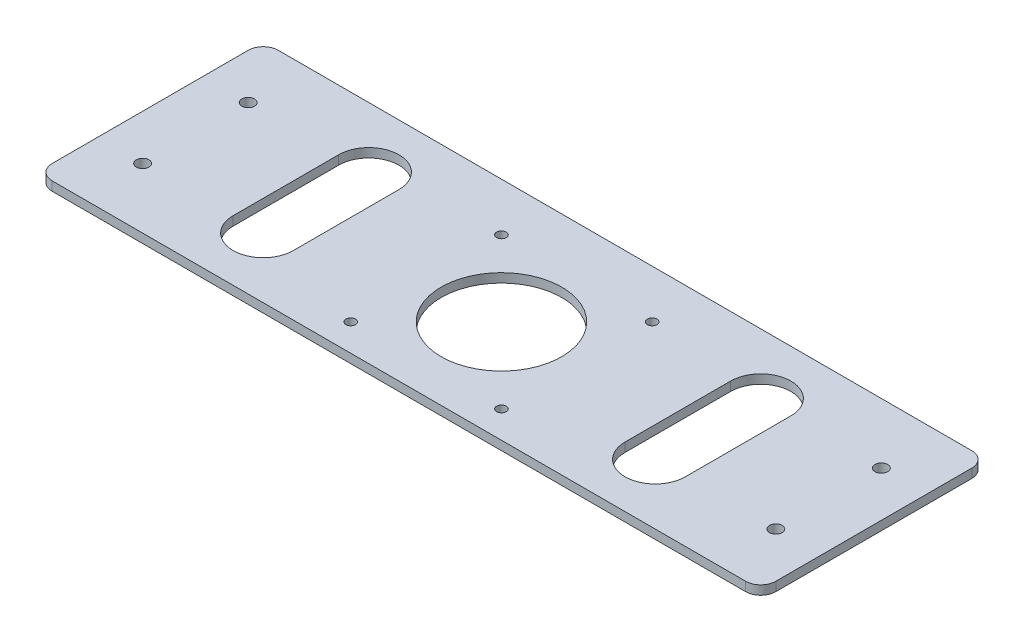
ISO-10303-21;
HEADER;
FILE_DESCRIPTION(('STEP AP214'),'2;1');
FILE_NAME('part.step','',(''),(''),'','','');
FILE_SCHEMA(('AUTOMOTIVE_DESIGN { 1 0 10303 214 1 1 1 1 }'));
ENDSEC;
DATA;
#1=APPLICATION_CONTEXT('core data for automotive mechanical design processes');
#2=APPLICATION_PROTOCOL_DEFINITION('international standard','automotive_design',2000,#1);
#3=PRODUCT_CONTEXT('',#1,'mechanical');
#4=PRODUCT('Part','Part','',(#3));
#5=PRODUCT_RELATED_PRODUCT_CATEGORY('part','',(#4));
#6=PRODUCT_DEFINITION_FORMATION('','',#4);
#7=PRODUCT_DEFINITION_CONTEXT('part definition',#1,'design');
#8=PRODUCT_DEFINITION('design','',#6,#7);
#9=PRODUCT_DEFINITION_SHAPE('','',#8);
#10=(LENGTH_UNIT() NAMED_UNIT(*) SI_UNIT(.MILLI.,.METRE.));
#11=(NAMED_UNIT(*) PLANE_ANGLE_UNIT() SI_UNIT($,.RADIAN.));
#12=(NAMED_UNIT(*) SI_UNIT($,.STERADIAN.) SOLID_ANGLE_UNIT());
#13=UNCERTAINTY_MEASURE_WITH_UNIT(LENGTH_MEASURE(1.E-05),#10,'distance_accuracy_value','');
#14=(GEOMETRIC_REPRESENTATION_CONTEXT(3) GLOBAL_UNCERTAINTY_ASSIGNED_CONTEXT((#13)) GLOBAL_UNIT_ASSIGNED_CONTEXT((#10,
#11,#12)) REPRESENTATION_CONTEXT('',''));
#15=CARTESIAN_POINT('',(0.,0.,0.));
#16=DIRECTION('',(0.,0.,1.));
#17=DIRECTION('',(1.,0.,0.));
#18=AXIS2_PLACEMENT_3D('',#15,#16,#17);
#19=CARTESIAN_POINT('',(0.,3.,0.));
#20=DIRECTION('',(0.,1.,0.));
#21=DIRECTION('',(0.,0.,1.));
#22=AXIS2_PLACEMENT_3D('',#19,#20,#21);
#23=PLANE('',#22);
#24=CARTESIAN_POINT('',(57.8259247718773,3.,29.8717507315553));
#25=DIRECTION('',(0.,1.,0.));
#26=DIRECTION('',(0.,0.,1.));
#27=AXIS2_PLACEMENT_3D('',#24,#25,#26);
#28=CIRCLE('',#27,1.60000000000002);
#29=CARTESIAN_POINT('',(57.8259247718773,3.,31.4717507315553));
#30=VERTEX_POINT('',#29);
#31=EDGE_CURVE('E271',#30,#30,#28,.F.);
#32=ORIENTED_EDGE('',*,*,#31,.T.);
#33=EDGE_LOOP('',(#32));
#34=FACE_BOUND('',#33,.T.);
#35=CARTESIAN_POINT('',(57.8259247718773,3.,79.8717507315553));
#36=DIRECTION('',(0.,1.,0.));
#37=DIRECTION('',(0.,0.,1.));
#38=AXIS2_PLACEMENT_3D('',#35,#36,#37);
#39=CIRCLE('',#38,1.60000000000002);
#40=CARTESIAN_POINT('',(57.8259247718773,3.,81.4717507315553));
#41=VERTEX_POINT('',#40);
#42=EDGE_CURVE('E268',#41,#41,#39,.T.);
#43=ORIENTED_EDGE('',*,*,#42,.F.);
#44=EDGE_LOOP('',(#43));
#45=FACE_BOUND('',#44,.T.);
#46=CARTESIAN_POINT('',(7.82592477187729,3.,29.8717507315553));
#47=DIRECTION('',(0.,1.,0.));
#48=DIRECTION('',(0.,0.,1.));
#49=AXIS2_PLACEMENT_3D('',#46,#47,#48);
#50=CIRCLE('',#49,1.6);
#51=CARTESIAN_POINT('',(7.82592477187729,3.,31.4717507315553));
#52=VERTEX_POINT('',#51);
#53=EDGE_CURVE('E265',#52,#52,#50,.T.);
#54=ORIENTED_EDGE('',*,*,#53,.F.);
#55=EDGE_LOOP('',(#54));
#56=FACE_BOUND('',#55,.T.);
#57=CARTESIAN_POINT('',(7.82592477187729,3.,79.8717507315553));
#58=DIRECTION('',(0.,1.,0.));
#59=DIRECTION('',(0.,0.,1.));
#60=AXIS2_PLACEMENT_3D('',#57,#58,#59);
#61=CIRCLE('',#60,1.6);
#62=CARTESIAN_POINT('',(7.82592477187729,3.,81.4717507315553));
#63=VERTEX_POINT('',#62);
#64=EDGE_CURVE('E262',#63,#63,#61,.F.);
#65=ORIENTED_EDGE('',*,*,#64,.T.);
#66=EDGE_LOOP('',(#65));
#67=FACE_BOUND('',#66,.T.);
#68=CARTESIAN_POINT('',(32.8259247718773,3.,54.8717507315553));
#69=DIRECTION('',(0.,1.,0.));
#70=DIRECTION('',(0.,0.,1.));
#71=AXIS2_PLACEMENT_3D('',#68,#69,#70);
#72=CIRCLE('',#71,20.);
#73=CARTESIAN_POINT('',(32.8259247718773,3.,74.8717507315553));
#74=VERTEX_POINT('',#73);
#75=EDGE_CURVE('E259',#74,#74,#72,.T.);
#76=ORIENTED_EDGE('',*,*,#75,.F.);
#77=EDGE_LOOP('',(#76));
#78=FACE_BOUND('',#77,.T.);
#79=CARTESIAN_POINT('',(-72.1740752281227,3.,33.8717507315553));
#80=DIRECTION('',(0.,1.,0.));
#81=DIRECTION('',(0.,0.,1.));
#82=AXIS2_PLACEMENT_3D('',#79,#80,#81);
#83=CIRCLE('',#82,2.1);
#84=CARTESIAN_POINT('',(-72.1740752281227,3.,35.9717507315553));
#85=VERTEX_POINT('',#84);
#86=EDGE_CURVE('E244',#85,#85,#83,.T.);
#87=ORIENTED_EDGE('',*,*,#86,.F.);
#88=EDGE_LOOP('',(#87));
#89=FACE_BOUND('',#88,.T.);
#90=CARTESIAN_POINT('',(-72.1740752281227,3.,68.8717507315553));
#91=DIRECTION('',(0.,1.,0.));
#92=DIRECTION('',(0.,0.,1.));
#93=AXIS2_PLACEMENT_3D('',#90,#91,#92);
#94=CIRCLE('',#93,2.1);
#95=CARTESIAN_POINT('',(-72.1740752281227,3.,70.9717507315553));
#96=VERTEX_POINT('',#95);
#97=EDGE_CURVE('E230',#96,#96,#94,.T.);
#98=ORIENTED_EDGE('',*,*,#97,.F.);
#99=EDGE_LOOP('',(#98));
#100=FACE_BOUND('',#99,.T.);
#101=CARTESIAN_POINT('',(137.825924771877,3.,68.8717507315553));
#102=DIRECTION('',(0.,1.,0.));
#103=DIRECTION('',(0.,0.,-1.));
#104=AXIS2_PLACEMENT_3D('',#101,#102,#103);
#105=CIRCLE('',#104,2.10000000000002);
#106=CARTESIAN_POINT('',(137.825924771877,3.,66.7717507315553));
#107=VERTEX_POINT('',#106);
#108=EDGE_CURVE('E237',#107,#107,#105,.T.);
#109=ORIENTED_EDGE('',*,*,#108,.F.);
#110=EDGE_LOOP('',(#109));
#111=FACE_BOUND('',#110,.T.);
#112=CARTESIAN_POINT('',(137.825924771877,3.,33.8717507315553));
#113=DIRECTION('',(0.,1.,0.));
#114=DIRECTION('',(0.,0.,-1.));
#115=AXIS2_PLACEMENT_3D('',#112,#113,#114);
#116=CIRCLE('',#115,2.10000000000002);
#117=CARTESIAN_POINT('',(137.825924771877,3.,31.7717507315553));
#118=VERTEX_POINT('',#117);
#119=EDGE_CURVE('E243',#118,#118,#116,.T.);
#120=ORIENTED_EDGE('',*,*,#119,.F.);
#121=EDGE_LOOP('',(#120));
#122=FACE_BOUND('',#121,.T.);
#123=DIRECTION('',(0.,0.,-1.));
#124=VECTOR('',#123,1.);
#125=CARTESIAN_POINT('',(-22.1740752281227,3.,68.8717507315553));
#126=LINE('',#125,#124);
#127=CARTESIAN_POINT('',(-22.1740752281227,3.,68.8717507315553));
#128=VERTEX_POINT('',#127);
#129=CARTESIAN_POINT('',(-22.1740752281227,3.,33.8717507315553));
#130=VERTEX_POINT('',#129);
#131=EDGE_CURVE('E165',#128,#130,#126,.T.);
#132=ORIENTED_EDGE('',*,*,#131,.F.);
#133=CARTESIAN_POINT('',(-32.1740752281227,3.,68.8717507315553));
#134=DIRECTION('',(0.,1.,0.));
#135=DIRECTION('',(0.,0.,1.));
#136=AXIS2_PLACEMENT_3D('',#133,#134,#135);
#137=CIRCLE('',#136,9.99999999999999);
#138=CARTESIAN_POINT('',(-42.1740752281227,3.,68.8717507315553));
#139=VERTEX_POINT('',#138);
#140=EDGE_CURVE('E155',#139,#128,#137,.T.);
#141=ORIENTED_EDGE('',*,*,#140,.F.);
#142=DIRECTION('',(0.,0.,1.));
#143=VECTOR('',#142,1.);
#144=CARTESIAN_POINT('',(-42.1740752281227,3.,68.8717507315553));
#145=LINE('',#144,#143);
#146=CARTESIAN_POINT('',(-42.1740752281227,3.,33.8717507315553));
#147=VERTEX_POINT('',#146);
#148=EDGE_CURVE('E181',#147,#139,#145,.T.);
#149=ORIENTED_EDGE('',*,*,#148,.F.);
#150=CARTESIAN_POINT('',(-32.1740752281227,3.,33.8717507315553));
#151=DIRECTION('',(0.,1.,0.));
#152=DIRECTION('',(0.,0.,1.));
#153=AXIS2_PLACEMENT_3D('',#150,#151,#152);
#154=CIRCLE('',#153,9.99999999999999);
#155=EDGE_CURVE('E179',#130,#147,#154,.T.);
#156=ORIENTED_EDGE('',*,*,#155,.F.);
#157=EDGE_LOOP('',(#132,#141,#149,#156));
#158=FACE_BOUND('',#157,.T.);
#159=DIRECTION('',(0.,0.,-1.));
#160=VECTOR('',#159,1.);
#161=CARTESIAN_POINT('',(107.825924771877,3.,68.8717507315553));
#162=LINE('',#161,#160);
#163=CARTESIAN_POINT('',(107.825924771877,3.,68.8717507315553));
#164=VERTEX_POINT('',#163);
#165=CARTESIAN_POINT('',(107.825924771877,3.,33.8717507315553));
#166=VERTEX_POINT('',#165);
#167=EDGE_CURVE('E201',#164,#166,#162,.T.);
#168=ORIENTED_EDGE('',*,*,#167,.F.);
#169=CARTESIAN_POINT('',(97.8259247718773,3.,68.8717507315553));
#170=DIRECTION('',(0.,1.,0.));
#171=DIRECTION('',(0.,0.,-1.));
#172=AXIS2_PLACEMENT_3D('',#169,#170,#171);
#173=CIRCLE('',#172,9.99999999999999);
#174=CARTESIAN_POINT('',(87.8259247718773,3.,68.8717507315553));
#175=VERTEX_POINT('',#174);
#176=EDGE_CURVE('E199',#175,#164,#173,.T.);
#177=ORIENTED_EDGE('',*,*,#176,.F.);
#178=DIRECTION('',(0.,0.,1.));
#179=VECTOR('',#178,1.);
#180=CARTESIAN_POINT('',(87.8259247718773,3.,68.8717507315553));
#181=LINE('',#180,#179);
#182=CARTESIAN_POINT('',(87.8259247718773,3.,33.8717507315553));
#183=VERTEX_POINT('',#182);
#184=EDGE_CURVE('E207',#183,#175,#181,.T.);
#185=ORIENTED_EDGE('',*,*,#184,.F.);
#186=CARTESIAN_POINT('',(97.8259247718773,3.,33.8717507315553));
#187=DIRECTION('',(0.,1.,0.));
#188=DIRECTION('',(0.,0.,-1.));
#189=AXIS2_PLACEMENT_3D('',#186,#187,#188);
#190=CIRCLE('',#189,9.99999999999999);
#191=EDGE_CURVE('E204',#166,#183,#190,.T.);
#192=ORIENTED_EDGE('',*,*,#191,.F.);
#193=EDGE_LOOP('',(#168,#177,#185,#192));
#194=FACE_BOUND('',#193,.T.);
#195=DIRECTION('',(1.,0.,0.));
#196=VECTOR('',#195,1.);
#197=CARTESIAN_POINT('',(0.,3.,13.8717507315553));
#198=LINE('',#197,#196);
#199=CARTESIAN_POINT('',(-82.1740752281227,3.,13.8717507315553));
#200=VERTEX_POINT('',#199);
#201=CARTESIAN_POINT('',(147.825924771877,3.,13.8717507315553));
#202=VERTEX_POINT('',#201);
#203=EDGE_CURVE('E214',#200,#202,#198,.T.);
#204=ORIENTED_EDGE('',*,*,#203,.F.);
#205=CARTESIAN_POINT('',(-82.1740752281227,3.,18.8717507315553));
#206=DIRECTION('',(0.,1.,0.));
#207=DIRECTION('',(0.,0.,1.));
#208=AXIS2_PLACEMENT_3D('',#205,#206,#207);
#209=CIRCLE('',#208,5.);
#210=CARTESIAN_POINT('',(-87.1740752281227,3.,18.8717507315553));
#211=VERTEX_POINT('',#210);
#212=EDGE_CURVE('E321',#200,#211,#209,.T.);
#213=ORIENTED_EDGE('',*,*,#212,.T.);
#214=DIRECTION('',(0.,0.,-1.));
#215=VECTOR('',#214,1.);
#216=CARTESIAN_POINT('',(-87.1740752281227,3.,0.));
#217=LINE('',#216,#215);
#218=CARTESIAN_POINT('',(-87.1740752281227,3.,83.8717507315553));
#219=VERTEX_POINT('',#218);
#220=EDGE_CURVE('E250',#219,#211,#217,.T.);
#221=ORIENTED_EDGE('',*,*,#220,.F.);
#222=CARTESIAN_POINT('',(-82.1740752281227,3.,83.8717507315553));
#223=DIRECTION('',(0.,1.,0.));
#224=DIRECTION('',(0.,0.,1.));
#225=AXIS2_PLACEMENT_3D('',#222,#223,#224);
#226=CIRCLE('',#225,5.);
#227=CARTESIAN_POINT('',(-82.1740752281227,3.,88.8717507315553));
#228=VERTEX_POINT('',#227);
#229=EDGE_CURVE('E298',#219,#228,#226,.T.);
#230=ORIENTED_EDGE('',*,*,#229,.T.);
#231=DIRECTION('',(1.,0.,0.));
#232=VECTOR('',#231,1.);
#233=CARTESIAN_POINT('',(0.,3.,88.8717507315553));
#234=LINE('',#233,#232);
#235=CARTESIAN_POINT('',(147.825924771877,3.,88.8717507315553));
#236=VERTEX_POINT('',#235);
#237=EDGE_CURVE('E252',#228,#236,#234,.T.);
#238=ORIENTED_EDGE('',*,*,#237,.T.);
#239=CARTESIAN_POINT('',(147.825924771877,3.,83.8717507315553));
#240=DIRECTION('',(0.,1.,0.));
#241=DIRECTION('',(0.,0.,1.));
#242=AXIS2_PLACEMENT_3D('',#239,#240,#241);
#243=CIRCLE('',#242,5.);
#244=CARTESIAN_POINT('',(152.825924771877,3.,83.8717507315553));
#245=VERTEX_POINT('',#244);
#246=EDGE_CURVE('E300',#236,#245,#243,.T.);
#247=ORIENTED_EDGE('',*,*,#246,.T.);
#248=DIRECTION('',(0.,0.,-1.));
#249=VECTOR('',#248,1.);
#250=CARTESIAN_POINT('',(152.825924771877,3.,0.));
#251=LINE('',#250,#249);
#252=CARTESIAN_POINT('',(152.825924771877,3.,18.8717507315553));
#253=VERTEX_POINT('',#252);
#254=EDGE_CURVE('E256',#245,#253,#251,.T.);
#255=ORIENTED_EDGE('',*,*,#254,.T.);
#256=CARTESIAN_POINT('',(147.825924771877,3.,18.8717507315553));
#257=DIRECTION('',(0.,1.,0.));
#258=DIRECTION('',(0.,0.,1.));
#259=AXIS2_PLACEMENT_3D('',#256,#257,#258);
#260=CIRCLE('',#259,5.);
#261=EDGE_CURVE('E319',#253,#202,#260,.T.);
#262=ORIENTED_EDGE('',*,*,#261,.T.);
#263=EDGE_LOOP('',(#204,#213,#221,#230,#238,#247,#255,#262));
#264=FACE_BOUND('',#263,.T.);
#265=ADVANCED_FACE('F37',(#34,#45,#56,#67,#78,#89,#100,#111,#122,#158,#194,#264),#23,.T.);
#266=CARTESIAN_POINT('',(0.,0.,0.));
#267=DIRECTION('',(0.,1.,0.));
#268=DIRECTION('',(0.,0.,1.));
#269=AXIS2_PLACEMENT_3D('',#266,#267,#268);
#270=PLANE('',#269);
#271=CARTESIAN_POINT('',(57.8259247718773,0.,29.8717507315553));
#272=DIRECTION('',(0.,1.,0.));
#273=DIRECTION('',(0.,0.,1.));
#274=AXIS2_PLACEMENT_3D('',#271,#272,#273);
#275=CIRCLE('',#274,1.60000000000002);
#276=CARTESIAN_POINT('',(57.8259247718773,0.,31.4717507315553));
#277=VERTEX_POINT('',#276);
#278=EDGE_CURVE('E253',#277,#277,#275,.F.);
#279=ORIENTED_EDGE('',*,*,#278,.F.);
#280=EDGE_LOOP('',(#279));
#281=FACE_BOUND('',#280,.T.);
#282=CARTESIAN_POINT('',(57.8259247718773,0.,79.8717507315553));
#283=DIRECTION('',(0.,1.,0.));
#284=DIRECTION('',(0.,0.,1.));
#285=AXIS2_PLACEMENT_3D('',#282,#283,#284);
#286=CIRCLE('',#285,1.60000000000002);
#287=CARTESIAN_POINT('',(57.8259247718773,0.,81.4717507315553));
#288=VERTEX_POINT('',#287);
#289=EDGE_CURVE('E290',#288,#288,#286,.T.);
#290=ORIENTED_EDGE('',*,*,#289,.T.);
#291=EDGE_LOOP('',(#290));
#292=FACE_BOUND('',#291,.T.);
#293=CARTESIAN_POINT('',(7.82592477187729,0.,29.8717507315553));
#294=DIRECTION('',(0.,1.,0.));
#295=DIRECTION('',(0.,0.,1.));
#296=AXIS2_PLACEMENT_3D('',#293,#294,#295);
#297=CIRCLE('',#296,1.6);
#298=CARTESIAN_POINT('',(7.82592477187729,0.,31.4717507315553));
#299=VERTEX_POINT('',#298);
#300=EDGE_CURVE('E287',#299,#299,#297,.T.);
#301=ORIENTED_EDGE('',*,*,#300,.T.);
#302=EDGE_LOOP('',(#301));
#303=FACE_BOUND('',#302,.T.);
#304=CARTESIAN_POINT('',(7.82592477187729,0.,79.8717507315553));
#305=DIRECTION('',(0.,1.,0.));
#306=DIRECTION('',(0.,0.,1.));
#307=AXIS2_PLACEMENT_3D('',#304,#305,#306);
#308=CIRCLE('',#307,1.6);
#309=CARTESIAN_POINT('',(7.82592477187729,0.,81.4717507315553));
#310=VERTEX_POINT('',#309);
#311=EDGE_CURVE('E284',#310,#310,#308,.F.);
#312=ORIENTED_EDGE('',*,*,#311,.F.);
#313=EDGE_LOOP('',(#312));
#314=FACE_BOUND('',#313,.T.);
#315=CARTESIAN_POINT('',(32.8259247718773,0.,54.8717507315553));
#316=DIRECTION('',(0.,1.,0.));
#317=DIRECTION('',(0.,0.,1.));
#318=AXIS2_PLACEMENT_3D('',#315,#316,#317);
#319=CIRCLE('',#318,20.);
#320=CARTESIAN_POINT('',(32.8259247718773,0.,74.8717507315553));
#321=VERTEX_POINT('',#320);
#322=EDGE_CURVE('E281',#321,#321,#319,.T.);
#323=ORIENTED_EDGE('',*,*,#322,.T.);
#324=EDGE_LOOP('',(#323));
#325=FACE_BOUND('',#324,.T.);
#326=CARTESIAN_POINT('',(-72.1740752281227,0.,33.8717507315553));
#327=DIRECTION('',(0.,1.,0.));
#328=DIRECTION('',(0.,0.,1.));
#329=AXIS2_PLACEMENT_3D('',#326,#327,#328);
#330=CIRCLE('',#329,2.1);
#331=CARTESIAN_POINT('',(-72.1740752281227,0.,35.9717507315553));
#332=VERTEX_POINT('',#331);
#333=EDGE_CURVE('E233',#332,#332,#330,.T.);
#334=ORIENTED_EDGE('',*,*,#333,.T.);
#335=EDGE_LOOP('',(#334));
#336=FACE_BOUND('',#335,.T.);
#337=CARTESIAN_POINT('',(-72.1740752281227,0.,68.8717507315553));
#338=DIRECTION('',(0.,1.,0.));
#339=DIRECTION('',(0.,0.,1.));
#340=AXIS2_PLACEMENT_3D('',#337,#338,#339);
#341=CIRCLE('',#340,2.1);
#342=CARTESIAN_POINT('',(-72.1740752281227,0.,70.9717507315553));
#343=VERTEX_POINT('',#342);
#344=EDGE_CURVE('E234',#343,#343,#341,.T.);
#345=ORIENTED_EDGE('',*,*,#344,.T.);
#346=EDGE_LOOP('',(#345));
#347=FACE_BOUND('',#346,.T.);
#348=CARTESIAN_POINT('',(137.825924771877,0.,68.8717507315553));
#349=DIRECTION('',(0.,1.,0.));
#350=DIRECTION('',(0.,0.,-1.));
#351=AXIS2_PLACEMENT_3D('',#348,#349,#350);
#352=CIRCLE('',#351,2.10000000000002);
#353=CARTESIAN_POINT('',(137.825924771877,0.,66.7717507315553));
#354=VERTEX_POINT('',#353);
#355=EDGE_CURVE('E240',#354,#354,#352,.T.);
#356=ORIENTED_EDGE('',*,*,#355,.T.);
#357=EDGE_LOOP('',(#356));
#358=FACE_BOUND('',#357,.T.);
#359=CARTESIAN_POINT('',(137.825924771877,0.,33.8717507315553));
#360=DIRECTION('',(0.,1.,0.));
#361=DIRECTION('',(0.,0.,-1.));
#362=AXIS2_PLACEMENT_3D('',#359,#360,#361);
#363=CIRCLE('',#362,2.10000000000002);
#364=CARTESIAN_POINT('',(137.825924771877,0.,31.7717507315553));
#365=VERTEX_POINT('',#364);
#366=EDGE_CURVE('E173',#365,#365,#363,.T.);
#367=ORIENTED_EDGE('',*,*,#366,.T.);
#368=EDGE_LOOP('',(#367));
#369=FACE_BOUND('',#368,.T.);
#370=CARTESIAN_POINT('',(-32.1740752281227,0.,68.8717507315553));
#371=DIRECTION('',(0.,1.,0.));
#372=DIRECTION('',(0.,0.,1.));
#373=AXIS2_PLACEMENT_3D('',#370,#371,#372);
#374=CIRCLE('',#373,9.99999999999999);
#375=CARTESIAN_POINT('',(-42.1740752281227,0.,68.8717507315553));
#376=VERTEX_POINT('',#375);
#377=CARTESIAN_POINT('',(-22.1740752281227,0.,68.8717507315553));
#378=VERTEX_POINT('',#377);
#379=EDGE_CURVE('E186',#376,#378,#374,.T.);
#380=ORIENTED_EDGE('',*,*,#379,.T.);
#381=DIRECTION('',(0.,0.,-1.));
#382=VECTOR('',#381,1.);
#383=CARTESIAN_POINT('',(-22.1740752281227,0.,68.8717507315553));
#384=LINE('',#383,#382);
#385=CARTESIAN_POINT('',(-22.1740752281227,0.,33.8717507315553));
#386=VERTEX_POINT('',#385);
#387=EDGE_CURVE('E172',#378,#386,#384,.T.);
#388=ORIENTED_EDGE('',*,*,#387,.T.);
#389=CARTESIAN_POINT('',(-32.1740752281227,0.,33.8717507315553));
#390=DIRECTION('',(0.,1.,0.));
#391=DIRECTION('',(0.,0.,1.));
#392=AXIS2_PLACEMENT_3D('',#389,#390,#391);
#393=CIRCLE('',#392,9.99999999999999);
#394=CARTESIAN_POINT('',(-42.1740752281227,0.,33.8717507315553));
#395=VERTEX_POINT('',#394);
#396=EDGE_CURVE('E190',#386,#395,#393,.T.);
#397=ORIENTED_EDGE('',*,*,#396,.T.);
#398=DIRECTION('',(0.,0.,1.));
#399=VECTOR('',#398,1.);
#400=CARTESIAN_POINT('',(-42.1740752281227,0.,68.8717507315553));
#401=LINE('',#400,#399);
#402=EDGE_CURVE('E166',#395,#376,#401,.T.);
#403=ORIENTED_EDGE('',*,*,#402,.T.);
#404=EDGE_LOOP('',(#380,#388,#397,#403));
#405=FACE_BOUND('',#404,.T.);
#406=CARTESIAN_POINT('',(97.8259247718773,0.,68.8717507315553));
#407=DIRECTION('',(0.,1.,0.));
#408=DIRECTION('',(0.,0.,-1.));
#409=AXIS2_PLACEMENT_3D('',#406,#407,#408);
#410=CIRCLE('',#409,9.99999999999999);
#411=CARTESIAN_POINT('',(87.8259247718773,0.,68.8717507315553));
#412=VERTEX_POINT('',#411);
#413=CARTESIAN_POINT('',(107.825924771877,0.,68.8717507315553));
#414=VERTEX_POINT('',#413);
#415=EDGE_CURVE('E210',#412,#414,#410,.T.);
#416=ORIENTED_EDGE('',*,*,#415,.T.);
#417=DIRECTION('',(0.,0.,-1.));
#418=VECTOR('',#417,1.);
#419=CARTESIAN_POINT('',(107.825924771877,0.,68.8717507315553));
#420=LINE('',#419,#418);
#421=CARTESIAN_POINT('',(107.825924771877,0.,33.8717507315553));
#422=VERTEX_POINT('',#421);
#423=EDGE_CURVE('E213',#414,#422,#420,.T.);
#424=ORIENTED_EDGE('',*,*,#423,.T.);
#425=CARTESIAN_POINT('',(97.8259247718773,0.,33.8717507315553));
#426=DIRECTION('',(0.,1.,0.));
#427=DIRECTION('',(0.,0.,-1.));
#428=AXIS2_PLACEMENT_3D('',#425,#426,#427);
#429=CIRCLE('',#428,9.99999999999999);
#430=CARTESIAN_POINT('',(87.8259247718773,0.,33.8717507315553));
#431=VERTEX_POINT('',#430);
#432=EDGE_CURVE('E217',#422,#431,#429,.T.);
#433=ORIENTED_EDGE('',*,*,#432,.T.);
#434=DIRECTION('',(0.,0.,1.));
#435=VECTOR('',#434,1.);
#436=CARTESIAN_POINT('',(87.8259247718773,0.,68.8717507315553));
#437=LINE('',#436,#435);
#438=EDGE_CURVE('E202',#431,#412,#437,.T.);
#439=ORIENTED_EDGE('',*,*,#438,.T.);
#440=EDGE_LOOP('',(#416,#424,#433,#439));
#441=FACE_BOUND('',#440,.T.);
#442=DIRECTION('',(0.,0.,-1.));
#443=VECTOR('',#442,1.);
#444=CARTESIAN_POINT('',(-87.1740752281227,0.,0.));
#445=LINE('',#444,#443);
#446=CARTESIAN_POINT('',(-87.1740752281227,0.,83.8717507315553));
#447=VERTEX_POINT('',#446);
#448=CARTESIAN_POINT('',(-87.1740752281227,0.,18.8717507315553));
#449=VERTEX_POINT('',#448);
#450=EDGE_CURVE('E247',#447,#449,#445,.T.);
#451=ORIENTED_EDGE('',*,*,#450,.T.);
#452=CARTESIAN_POINT('',(-82.1740752281227,0.,18.8717507315553));
#453=DIRECTION('',(0.,1.,0.));
#454=DIRECTION('',(0.,0.,1.));
#455=AXIS2_PLACEMENT_3D('',#452,#453,#454);
#456=CIRCLE('',#455,5.);
#457=CARTESIAN_POINT('',(-82.1740752281227,0.,13.8717507315553));
#458=VERTEX_POINT('',#457);
#459=EDGE_CURVE('E45',#449,#458,#456,.F.);
#460=ORIENTED_EDGE('',*,*,#459,.T.);
#461=DIRECTION('',(1.,0.,0.));
#462=VECTOR('',#461,1.);
#463=CARTESIAN_POINT('',(0.,0.,13.8717507315553));
#464=LINE('',#463,#462);
#465=CARTESIAN_POINT('',(147.825924771877,0.,13.8717507315553));
#466=VERTEX_POINT('',#465);
#467=EDGE_CURVE('E312',#458,#466,#464,.T.);
#468=ORIENTED_EDGE('',*,*,#467,.T.);
#469=CARTESIAN_POINT('',(147.825924771877,0.,18.8717507315553));
#470=DIRECTION('',(0.,1.,0.));
#471=DIRECTION('',(0.,0.,1.));
#472=AXIS2_PLACEMENT_3D('',#469,#470,#471);
#473=CIRCLE('',#472,5.);
#474=CARTESIAN_POINT('',(152.825924771877,0.,18.8717507315553));
#475=VERTEX_POINT('',#474);
#476=EDGE_CURVE('E52',#466,#475,#473,.F.);
#477=ORIENTED_EDGE('',*,*,#476,.T.);
#478=DIRECTION('',(0.,0.,-1.));
#479=VECTOR('',#478,1.);
#480=CARTESIAN_POINT('',(152.825924771877,0.,0.));
#481=LINE('',#480,#479);
#482=CARTESIAN_POINT('',(152.825924771877,0.,83.8717507315553));
#483=VERTEX_POINT('',#482);
#484=EDGE_CURVE('E279',#483,#475,#481,.T.);
#485=ORIENTED_EDGE('',*,*,#484,.F.);
#486=CARTESIAN_POINT('',(147.825924771877,0.,83.8717507315553));
#487=DIRECTION('',(0.,1.,0.));
#488=DIRECTION('',(0.,0.,1.));
#489=AXIS2_PLACEMENT_3D('',#486,#487,#488);
#490=CIRCLE('',#489,5.);
#491=CARTESIAN_POINT('',(147.825924771877,0.,88.8717507315553));
#492=VERTEX_POINT('',#491);
#493=EDGE_CURVE('E296',#483,#492,#490,.F.);
#494=ORIENTED_EDGE('',*,*,#493,.T.);
#495=DIRECTION('',(1.,0.,0.));
#496=VECTOR('',#495,1.);
#497=CARTESIAN_POINT('',(0.,0.,88.8717507315553));
#498=LINE('',#497,#496);
#499=CARTESIAN_POINT('',(-82.1740752281227,0.,88.8717507315553));
#500=VERTEX_POINT('',#499);
#501=EDGE_CURVE('E276',#500,#492,#498,.T.);
#502=ORIENTED_EDGE('',*,*,#501,.F.);
#503=CARTESIAN_POINT('',(-82.1740752281227,0.,83.8717507315553));
#504=DIRECTION('',(0.,1.,0.));
#505=DIRECTION('',(0.,0.,1.));
#506=AXIS2_PLACEMENT_3D('',#503,#504,#505);
#507=CIRCLE('',#506,5.);
#508=EDGE_CURVE('E274',#500,#447,#507,.F.);
#509=ORIENTED_EDGE('',*,*,#508,.T.);
#510=EDGE_LOOP('',(#451,#460,#468,#477,#485,#494,#502,#509));
#511=FACE_BOUND('',#510,.T.);
#512=ADVANCED_FACE('F326',(#281,#292,#303,#314,#325,#336,#347,#358,#369,#405,#441,#511),#270,.F.);
#513=CARTESIAN_POINT('',(-87.1740752281227,3.,0.));
#514=DIRECTION('',(-1.,0.,0.));
#515=DIRECTION('',(0.,0.,1.));
#516=AXIS2_PLACEMENT_3D('',#513,#514,#515);
#517=PLANE('',#516);
#518=ORIENTED_EDGE('',*,*,#220,.T.);
#519=DIRECTION('',(0.,1.,0.));
#520=VECTOR('',#519,1.);
#521=CARTESIAN_POINT('',(-87.1740752281227,0.,18.8717507315553));
#522=LINE('',#521,#520);
#523=EDGE_CURVE('E60',#211,#449,#522,.F.);
#524=ORIENTED_EDGE('',*,*,#523,.T.);
#525=ORIENTED_EDGE('',*,*,#450,.F.);
#526=DIRECTION('',(0.,-1.,0.));
#527=VECTOR('',#526,1.);
#528=CARTESIAN_POINT('',(-87.1740752281227,3.,83.8717507315553));
#529=LINE('',#528,#527);
#530=EDGE_CURVE('E310',#447,#219,#529,.F.);
#531=ORIENTED_EDGE('',*,*,#530,.T.);
#532=EDGE_LOOP('',(#518,#524,#525,#531));
#533=FACE_BOUND('',#532,.T.);
#534=ADVANCED_FACE('F338',(#533),#517,.T.);
#535=CARTESIAN_POINT('',(0.,3.,88.8717507315553));
#536=DIRECTION('',(0.,0.,-1.));
#537=DIRECTION('',(-1.,0.,0.));
#538=AXIS2_PLACEMENT_3D('',#535,#536,#537);
#539=PLANE('',#538);
#540=ORIENTED_EDGE('',*,*,#501,.T.);
#541=DIRECTION('',(0.,-1.,0.));
#542=VECTOR('',#541,1.);
#543=CARTESIAN_POINT('',(147.825924771877,3.,88.8717507315553));
#544=LINE('',#543,#542);
#545=EDGE_CURVE('E308',#492,#236,#544,.F.);
#546=ORIENTED_EDGE('',*,*,#545,.T.);
#547=ORIENTED_EDGE('',*,*,#237,.F.);
#548=DIRECTION('',(0.,-1.,0.));
#549=VECTOR('',#548,1.);
#550=CARTESIAN_POINT('',(-82.1740752281227,0.,88.8717507315553));
#551=LINE('',#550,#549);
#552=EDGE_CURVE('E305',#228,#500,#551,.T.);
#553=ORIENTED_EDGE('',*,*,#552,.T.);
#554=EDGE_LOOP('',(#540,#546,#547,#553));
#555=FACE_BOUND('',#554,.T.);
#556=ADVANCED_FACE('F346',(#555),#539,.F.);
#557=CARTESIAN_POINT('',(152.825924771877,3.,0.));
#558=DIRECTION('',(-1.,0.,0.));
#559=DIRECTION('',(0.,0.,1.));
#560=AXIS2_PLACEMENT_3D('',#557,#558,#559);
#561=PLANE('',#560);
#562=ORIENTED_EDGE('',*,*,#484,.T.);
#563=DIRECTION('',(0.,1.,0.));
#564=VECTOR('',#563,1.);
#565=CARTESIAN_POINT('',(152.825924771877,3.,18.8717507315553));
#566=LINE('',#565,#564);
#567=EDGE_CURVE('E11',#475,#253,#566,.T.);
#568=ORIENTED_EDGE('',*,*,#567,.T.);
#569=ORIENTED_EDGE('',*,*,#254,.F.);
#570=DIRECTION('',(0.,-1.,0.));
#571=VECTOR('',#570,1.);
#572=CARTESIAN_POINT('',(152.825924771877,3.,83.8717507315553));
#573=LINE('',#572,#571);
#574=EDGE_CURVE('E302',#245,#483,#573,.T.);
#575=ORIENTED_EDGE('',*,*,#574,.T.);
#576=EDGE_LOOP('',(#562,#568,#569,#575));
#577=FACE_BOUND('',#576,.T.);
#578=ADVANCED_FACE('F354',(#577),#561,.F.);
#579=CARTESIAN_POINT('',(57.8259247718773,3.,79.8717507315553));
#580=DIRECTION('',(0.,-1.,0.));
#581=DIRECTION('',(0.,0.,-1.));
#582=AXIS2_PLACEMENT_3D('',#579,#580,#581);
#583=CYLINDRICAL_SURFACE('',#582,1.60000000000002);
#584=ORIENTED_EDGE('',*,*,#42,.T.);
#585=EDGE_LOOP('',(#584));
#586=FACE_BOUND('',#585,.T.);
#587=ORIENTED_EDGE('',*,*,#289,.F.);
#588=EDGE_LOOP('',(#587));
#589=FACE_BOUND('',#588,.T.);
#590=ADVANCED_FACE('F397',(#586,#589),#583,.F.);
#591=CARTESIAN_POINT('',(7.82592477187729,3.,29.8717507315553));
#592=DIRECTION('',(0.,-1.,0.));
#593=DIRECTION('',(0.,0.,-1.));
#594=AXIS2_PLACEMENT_3D('',#591,#592,#593);
#595=CYLINDRICAL_SURFACE('',#594,1.6);
#596=ORIENTED_EDGE('',*,*,#53,.T.);
#597=EDGE_LOOP('',(#596));
#598=FACE_BOUND('',#597,.T.);
#599=ORIENTED_EDGE('',*,*,#300,.F.);
#600=EDGE_LOOP('',(#599));
#601=FACE_BOUND('',#600,.T.);
#602=ADVANCED_FACE('F400',(#598,#601),#595,.F.);
#603=CARTESIAN_POINT('',(7.82592477187729,3.,79.8717507315553));
#604=DIRECTION('',(0.,-1.,0.));
#605=DIRECTION('',(0.,0.,-1.));
#606=AXIS2_PLACEMENT_3D('',#603,#604,#605);
#607=CYLINDRICAL_SURFACE('',#606,1.6);
#608=ORIENTED_EDGE('',*,*,#64,.F.);
#609=EDGE_LOOP('',(#608));
#610=FACE_BOUND('',#609,.T.);
#611=ORIENTED_EDGE('',*,*,#311,.T.);
#612=EDGE_LOOP('',(#611));
#613=FACE_BOUND('',#612,.T.);
#614=ADVANCED_FACE('F404',(#610,#613),#607,.F.);
#615=CARTESIAN_POINT('',(32.8259247718773,3.,54.8717507315553));
#616=DIRECTION('',(0.,-1.,0.));
#617=DIRECTION('',(0.,0.,-1.));
#618=AXIS2_PLACEMENT_3D('',#615,#616,#617);
#619=CYLINDRICAL_SURFACE('',#618,20.);
#620=ORIENTED_EDGE('',*,*,#75,.T.);
#621=EDGE_LOOP('',(#620));
#622=FACE_BOUND('',#621,.T.);
#623=ORIENTED_EDGE('',*,*,#322,.F.);
#624=EDGE_LOOP('',(#623));
#625=FACE_BOUND('',#624,.T.);
#626=ADVANCED_FACE('F395',(#622,#625),#619,.F.);
#627=CARTESIAN_POINT('',(57.8259247718773,3.,29.8717507315553));
#628=DIRECTION('',(0.,-1.,0.));
#629=DIRECTION('',(0.,0.,-1.));
#630=AXIS2_PLACEMENT_3D('',#627,#628,#629);
#631=CYLINDRICAL_SURFACE('',#630,1.60000000000002);
#632=ORIENTED_EDGE('',*,*,#31,.F.);
#633=EDGE_LOOP('',(#632));
#634=FACE_BOUND('',#633,.T.);
#635=ORIENTED_EDGE('',*,*,#278,.T.);
#636=EDGE_LOOP('',(#635));
#637=FACE_BOUND('',#636,.T.);
#638=ADVANCED_FACE('F392',(#634,#637),#631,.F.);
#639=CARTESIAN_POINT('',(147.825924771877,3.,83.8717507315553));
#640=DIRECTION('',(0.,-1.,0.));
#641=DIRECTION('',(0.,0.,-1.));
#642=AXIS2_PLACEMENT_3D('',#639,#640,#641);
#643=CYLINDRICAL_SURFACE('',#642,5.);
#644=ORIENTED_EDGE('',*,*,#246,.F.);
#645=ORIENTED_EDGE('',*,*,#545,.F.);
#646=ORIENTED_EDGE('',*,*,#493,.F.);
#647=ORIENTED_EDGE('',*,*,#574,.F.);
#648=EDGE_LOOP('',(#644,#645,#646,#647));
#649=FACE_BOUND('',#648,.T.);
#650=ADVANCED_FACE('F350',(#649),#643,.T.);
#651=CARTESIAN_POINT('',(-82.1740752281227,3.,83.8717507315553));
#652=DIRECTION('',(0.,1.,0.));
#653=DIRECTION('',(0.,0.,1.));
#654=AXIS2_PLACEMENT_3D('',#651,#652,#653);
#655=CYLINDRICAL_SURFACE('',#654,5.);
#656=ORIENTED_EDGE('',*,*,#229,.F.);
#657=ORIENTED_EDGE('',*,*,#530,.F.);
#658=ORIENTED_EDGE('',*,*,#508,.F.);
#659=ORIENTED_EDGE('',*,*,#552,.F.);
#660=EDGE_LOOP('',(#656,#657,#658,#659));
#661=FACE_BOUND('',#660,.T.);
#662=ADVANCED_FACE('F341',(#661),#655,.T.);
#663=CARTESIAN_POINT('',(-72.1740752281227,3.,33.8717507315553));
#664=DIRECTION('',(0.,-1.,0.));
#665=DIRECTION('',(0.,0.,-1.));
#666=AXIS2_PLACEMENT_3D('',#663,#664,#665);
#667=CYLINDRICAL_SURFACE('',#666,2.1);
#668=ORIENTED_EDGE('',*,*,#86,.T.);
#669=EDGE_LOOP('',(#668));
#670=FACE_BOUND('',#669,.T.);
#671=ORIENTED_EDGE('',*,*,#333,.F.);
#672=EDGE_LOOP('',(#671));
#673=FACE_BOUND('',#672,.T.);
#674=ADVANCED_FACE('F390',(#670,#673),#667,.F.);
#675=CARTESIAN_POINT('',(-72.1740752281227,3.,68.8717507315553));
#676=DIRECTION('',(0.,-1.,0.));
#677=DIRECTION('',(0.,0.,-1.));
#678=AXIS2_PLACEMENT_3D('',#675,#676,#677);
#679=CYLINDRICAL_SURFACE('',#678,2.1);
#680=ORIENTED_EDGE('',*,*,#97,.T.);
#681=EDGE_LOOP('',(#680));
#682=FACE_BOUND('',#681,.T.);
#683=ORIENTED_EDGE('',*,*,#344,.F.);
#684=EDGE_LOOP('',(#683));
#685=FACE_BOUND('',#684,.T.);
#686=ADVANCED_FACE('F375',(#682,#685),#679,.F.);
#687=CARTESIAN_POINT('',(137.825924771877,3.,68.8717507315553));
#688=DIRECTION('',(0.,-1.,0.));
#689=DIRECTION('',(0.,0.,-1.));
#690=AXIS2_PLACEMENT_3D('',#687,#688,#689);
#691=CYLINDRICAL_SURFACE('',#690,2.10000000000002);
#692=ORIENTED_EDGE('',*,*,#108,.T.);
#693=EDGE_LOOP('',(#692));
#694=FACE_BOUND('',#693,.T.);
#695=ORIENTED_EDGE('',*,*,#355,.F.);
#696=EDGE_LOOP('',(#695));
#697=FACE_BOUND('',#696,.T.);
#698=ADVANCED_FACE('F367',(#694,#697),#691,.F.);
#699=CARTESIAN_POINT('',(137.825924771877,3.,33.8717507315553));
#700=DIRECTION('',(0.,-1.,0.));
#701=DIRECTION('',(0.,0.,-1.));
#702=AXIS2_PLACEMENT_3D('',#699,#700,#701);
#703=CYLINDRICAL_SURFACE('',#702,2.10000000000002);
#704=ORIENTED_EDGE('',*,*,#119,.T.);
#705=EDGE_LOOP('',(#704));
#706=FACE_BOUND('',#705,.T.);
#707=ORIENTED_EDGE('',*,*,#366,.F.);
#708=EDGE_LOOP('',(#707));
#709=FACE_BOUND('',#708,.T.);
#710=ADVANCED_FACE('F365',(#706,#709),#703,.F.);
#711=CARTESIAN_POINT('',(-32.1740752281227,3.,68.8717507315553));
#712=DIRECTION('',(0.,-1.,0.));
#713=DIRECTION('',(0.,0.,-1.));
#714=AXIS2_PLACEMENT_3D('',#711,#712,#713);
#715=CYLINDRICAL_SURFACE('',#714,9.99999999999999);
#716=ORIENTED_EDGE('',*,*,#379,.F.);
#717=DIRECTION('',(0.,-1.,0.));
#718=VECTOR('',#717,1.);
#719=CARTESIAN_POINT('',(-42.1740752281227,3.,68.8717507315553));
#720=LINE('',#719,#718);
#721=EDGE_CURVE('E161',#139,#376,#720,.T.);
#722=ORIENTED_EDGE('',*,*,#721,.F.);
#723=ORIENTED_EDGE('',*,*,#140,.T.);
#724=DIRECTION('',(0.,-1.,0.));
#725=VECTOR('',#724,1.);
#726=CARTESIAN_POINT('',(-22.1740752281227,3.,68.8717507315553));
#727=LINE('',#726,#725);
#728=EDGE_CURVE('E158',#128,#378,#727,.T.);
#729=ORIENTED_EDGE('',*,*,#728,.T.);
#730=EDGE_LOOP('',(#716,#722,#723,#729));
#731=FACE_BOUND('',#730,.T.);
#732=ADVANCED_FACE('F157',(#731),#715,.F.);
#733=CARTESIAN_POINT('',(-22.1740752281227,3.,68.8717507315553));
#734=DIRECTION('',(-1.,0.,0.));
#735=DIRECTION('',(0.,0.,1.));
#736=AXIS2_PLACEMENT_3D('',#733,#734,#735);
#737=PLANE('',#736);
#738=ORIENTED_EDGE('',*,*,#387,.F.);
#739=ORIENTED_EDGE('',*,*,#728,.F.);
#740=ORIENTED_EDGE('',*,*,#131,.T.);
#741=DIRECTION('',(0.,-1.,0.));
#742=VECTOR('',#741,1.);
#743=CARTESIAN_POINT('',(-22.1740752281227,3.,33.8717507315553));
#744=LINE('',#743,#742);
#745=EDGE_CURVE('E174',#130,#386,#744,.T.);
#746=ORIENTED_EDGE('',*,*,#745,.T.);
#747=EDGE_LOOP('',(#738,#739,#740,#746));
#748=FACE_BOUND('',#747,.T.);
#749=ADVANCED_FACE('F169',(#748),#737,.T.);
#750=CARTESIAN_POINT('',(-32.1740752281227,3.,33.8717507315553));
#751=DIRECTION('',(0.,-1.,0.));
#752=DIRECTION('',(0.,0.,-1.));
#753=AXIS2_PLACEMENT_3D('',#750,#751,#752);
#754=CYLINDRICAL_SURFACE('',#753,9.99999999999999);
#755=ORIENTED_EDGE('',*,*,#396,.F.);
#756=ORIENTED_EDGE('',*,*,#745,.F.);
#757=ORIENTED_EDGE('',*,*,#155,.T.);
#758=DIRECTION('',(0.,-1.,0.));
#759=VECTOR('',#758,1.);
#760=CARTESIAN_POINT('',(-42.1740752281227,3.,33.8717507315553));
#761=LINE('',#760,#759);
#762=EDGE_CURVE('E196',#147,#395,#761,.T.);
#763=ORIENTED_EDGE('',*,*,#762,.T.);
#764=EDGE_LOOP('',(#755,#756,#757,#763));
#765=FACE_BOUND('',#764,.T.);
#766=ADVANCED_FACE('F556',(#765),#754,.F.);
#767=CARTESIAN_POINT('',(-42.1740752281227,3.,68.8717507315553));
#768=DIRECTION('',(1.,0.,0.));
#769=DIRECTION('',(0.,0.,-1.));
#770=AXIS2_PLACEMENT_3D('',#767,#768,#769);
#771=PLANE('',#770);
#772=ORIENTED_EDGE('',*,*,#402,.F.);
#773=ORIENTED_EDGE('',*,*,#762,.F.);
#774=ORIENTED_EDGE('',*,*,#148,.T.);
#775=ORIENTED_EDGE('',*,*,#721,.T.);
#776=EDGE_LOOP('',(#772,#773,#774,#775));
#777=FACE_BOUND('',#776,.T.);
#778=ADVANCED_FACE('F448',(#777),#771,.T.);
#779=CARTESIAN_POINT('',(97.8259247718773,3.,68.8717507315553));
#780=DIRECTION('',(0.,-1.,0.));
#781=DIRECTION('',(0.,0.,-1.));
#782=AXIS2_PLACEMENT_3D('',#779,#780,#781);
#783=CYLINDRICAL_SURFACE('',#782,9.99999999999999);
#784=ORIENTED_EDGE('',*,*,#415,.F.);
#785=DIRECTION('',(0.,-1.,0.));
#786=VECTOR('',#785,1.);
#787=CARTESIAN_POINT('',(87.8259247718773,3.,68.8717507315553));
#788=LINE('',#787,#786);
#789=EDGE_CURVE('E209',#175,#412,#788,.T.);
#790=ORIENTED_EDGE('',*,*,#789,.F.);
#791=ORIENTED_EDGE('',*,*,#176,.T.);
#792=DIRECTION('',(0.,-1.,0.));
#793=VECTOR('',#792,1.);
#794=CARTESIAN_POINT('',(107.825924771877,3.,68.8717507315553));
#795=LINE('',#794,#793);
#796=EDGE_CURVE('E188',#164,#414,#795,.T.);
#797=ORIENTED_EDGE('',*,*,#796,.T.);
#798=EDGE_LOOP('',(#784,#790,#791,#797));
#799=FACE_BOUND('',#798,.T.);
#800=ADVANCED_FACE('F444',(#799),#783,.F.);
#801=CARTESIAN_POINT('',(107.825924771877,3.,68.8717507315553));
#802=DIRECTION('',(-1.,0.,0.));
#803=DIRECTION('',(0.,0.,1.));
#804=AXIS2_PLACEMENT_3D('',#801,#802,#803);
#805=PLANE('',#804);
#806=ORIENTED_EDGE('',*,*,#423,.F.);
#807=ORIENTED_EDGE('',*,*,#796,.F.);
#808=ORIENTED_EDGE('',*,*,#167,.T.);
#809=DIRECTION('',(0.,-1.,0.));
#810=VECTOR('',#809,1.);
#811=CARTESIAN_POINT('',(107.825924771877,3.,33.8717507315553));
#812=LINE('',#811,#810);
#813=EDGE_CURVE('E226',#166,#422,#812,.T.);
#814=ORIENTED_EDGE('',*,*,#813,.T.);
#815=EDGE_LOOP('',(#806,#807,#808,#814));
#816=FACE_BOUND('',#815,.T.);
#817=ADVANCED_FACE('F436',(#816),#805,.T.);
#818=CARTESIAN_POINT('',(97.8259247718773,3.,33.8717507315553));
#819=DIRECTION('',(0.,-1.,0.));
#820=DIRECTION('',(0.,0.,-1.));
#821=AXIS2_PLACEMENT_3D('',#818,#819,#820);
#822=CYLINDRICAL_SURFACE('',#821,9.99999999999999);
#823=ORIENTED_EDGE('',*,*,#432,.F.);
#824=ORIENTED_EDGE('',*,*,#813,.F.);
#825=ORIENTED_EDGE('',*,*,#191,.T.);
#826=DIRECTION('',(0.,-1.,0.));
#827=VECTOR('',#826,1.);
#828=CARTESIAN_POINT('',(87.8259247718773,3.,33.8717507315553));
#829=LINE('',#828,#827);
#830=EDGE_CURVE('E224',#183,#431,#829,.T.);
#831=ORIENTED_EDGE('',*,*,#830,.T.);
#832=EDGE_LOOP('',(#823,#824,#825,#831));
#833=FACE_BOUND('',#832,.T.);
#834=ADVANCED_FACE('F430',(#833),#822,.F.);
#835=CARTESIAN_POINT('',(87.8259247718773,3.,68.8717507315553));
#836=DIRECTION('',(1.,0.,0.));
#837=DIRECTION('',(0.,0.,-1.));
#838=AXIS2_PLACEMENT_3D('',#835,#836,#837);
#839=PLANE('',#838);
#840=ORIENTED_EDGE('',*,*,#438,.F.);
#841=ORIENTED_EDGE('',*,*,#830,.F.);
#842=ORIENTED_EDGE('',*,*,#184,.T.);
#843=ORIENTED_EDGE('',*,*,#789,.T.);
#844=EDGE_LOOP('',(#840,#841,#842,#843));
#845=FACE_BOUND('',#844,.T.);
#846=ADVANCED_FACE('F426',(#845),#839,.T.);
#847=CARTESIAN_POINT('',(0.,-7.,13.8717507315553));
#848=DIRECTION('',(0.,0.,1.));
#849=DIRECTION('',(1.,0.,0.));
#850=AXIS2_PLACEMENT_3D('',#847,#848,#849);
#851=PLANE('',#850);
#852=ORIENTED_EDGE('',*,*,#467,.F.);
#853=DIRECTION('',(0.,1.,0.));
#854=VECTOR('',#853,1.);
#855=CARTESIAN_POINT('',(-82.1740752281227,3.,13.8717507315553));
#856=LINE('',#855,#854);
#857=EDGE_CURVE('E316',#458,#200,#856,.T.);
#858=ORIENTED_EDGE('',*,*,#857,.T.);
#859=ORIENTED_EDGE('',*,*,#203,.T.);
#860=DIRECTION('',(0.,1.,0.));
#861=VECTOR('',#860,1.);
#862=CARTESIAN_POINT('',(147.825924771877,-7.,13.8717507315553));
#863=LINE('',#862,#861);
#864=EDGE_CURVE('E314',#202,#466,#863,.F.);
#865=ORIENTED_EDGE('',*,*,#864,.T.);
#866=EDGE_LOOP('',(#852,#858,#859,#865));
#867=FACE_BOUND('',#866,.T.);
#868=ADVANCED_FACE('F330',(#867),#851,.F.);
#869=CARTESIAN_POINT('',(-82.1740752281227,-7.,18.8717507315553));
#870=DIRECTION('',(0.,-1.,0.));
#871=DIRECTION('',(0.,0.,-1.));
#872=AXIS2_PLACEMENT_3D('',#869,#870,#871);
#873=CYLINDRICAL_SURFACE('',#872,5.);
#874=ORIENTED_EDGE('',*,*,#459,.F.);
#875=ORIENTED_EDGE('',*,*,#523,.F.);
#876=ORIENTED_EDGE('',*,*,#212,.F.);
#877=ORIENTED_EDGE('',*,*,#857,.F.);
#878=EDGE_LOOP('',(#874,#875,#876,#877));
#879=FACE_BOUND('',#878,.T.);
#880=ADVANCED_FACE('F334',(#879),#873,.T.);
#881=CARTESIAN_POINT('',(147.825924771877,3.,18.8717507315553));
#882=DIRECTION('',(0.,1.,0.));
#883=DIRECTION('',(0.,0.,1.));
#884=AXIS2_PLACEMENT_3D('',#881,#882,#883);
#885=CYLINDRICAL_SURFACE('',#884,5.);
#886=ORIENTED_EDGE('',*,*,#476,.F.);
#887=ORIENTED_EDGE('',*,*,#864,.F.);
#888=ORIENTED_EDGE('',*,*,#261,.F.);
#889=ORIENTED_EDGE('',*,*,#567,.F.);
#890=EDGE_LOOP('',(#886,#887,#888,#889));
#891=FACE_BOUND('',#890,.T.);
#892=ADVANCED_FACE('F39',(#891),#885,.T.);
#893=CLOSED_SHELL('',(#265,#512,#534,#556,#578,#590,#602,#614,#626,#638,#650,#662,#674,#686,
#698,#710,#732,#749,#766,#778,#800,#817,#834,#846,#868,#880,#892));
#894=MANIFOLD_SOLID_BREP('B2',#893);
#895=ADVANCED_BREP_SHAPE_REPRESENTATION('',(#18,#894),#14);
#896=SHAPE_DEFINITION_REPRESENTATION(#9,#895);
ENDSEC;
END-ISO-10303-21;
